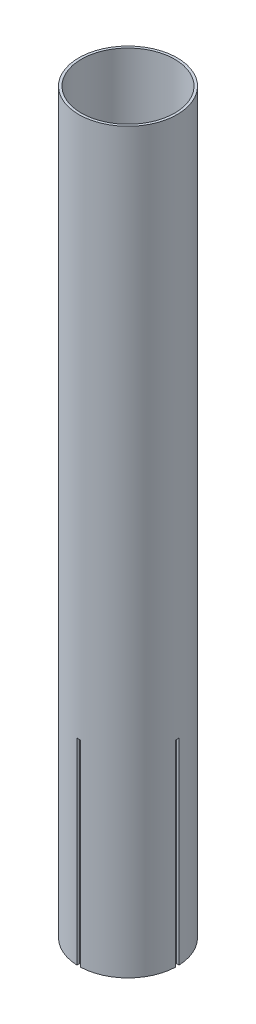
ISO-10303-21;
HEADER;
FILE_DESCRIPTION(('STEP AP214'),'2;1');
FILE_NAME('part.step','',(''),(''),'','','');
FILE_SCHEMA(('AUTOMOTIVE_DESIGN { 1 0 10303 214 1 1 1 1 }'));
ENDSEC;
DATA;
#1=APPLICATION_CONTEXT('core data for automotive mechanical design processes');
#2=APPLICATION_PROTOCOL_DEFINITION('international standard','automotive_design',2000,#1);
#3=PRODUCT_CONTEXT('',#1,'mechanical');
#4=PRODUCT('Part','Part','',(#3));
#5=PRODUCT_RELATED_PRODUCT_CATEGORY('part','',(#4));
#6=PRODUCT_DEFINITION_FORMATION('','',#4);
#7=PRODUCT_DEFINITION_CONTEXT('part definition',#1,'design');
#8=PRODUCT_DEFINITION('design','',#6,#7);
#9=PRODUCT_DEFINITION_SHAPE('','',#8);
#10=(LENGTH_UNIT() NAMED_UNIT(*) SI_UNIT(.MILLI.,.METRE.));
#11=(NAMED_UNIT(*) PLANE_ANGLE_UNIT() SI_UNIT($,.RADIAN.));
#12=(NAMED_UNIT(*) SI_UNIT($,.STERADIAN.) SOLID_ANGLE_UNIT());
#13=UNCERTAINTY_MEASURE_WITH_UNIT(LENGTH_MEASURE(1.E-05),#10,'distance_accuracy_value','');
#14=(GEOMETRIC_REPRESENTATION_CONTEXT(3) GLOBAL_UNCERTAINTY_ASSIGNED_CONTEXT((#13)) GLOBAL_UNIT_ASSIGNED_CONTEXT((#10,
#11,#12)) REPRESENTATION_CONTEXT('',''));
#15=CARTESIAN_POINT('',(0.,0.,0.));
#16=DIRECTION('',(0.,0.,1.));
#17=DIRECTION('',(1.,0.,0.));
#18=AXIS2_PLACEMENT_3D('',#15,#16,#17);
#19=CARTESIAN_POINT('',(0.,0.,0.));
#20=DIRECTION('',(0.,1.,0.));
#21=DIRECTION('',(0.,0.,1.));
#22=AXIS2_PLACEMENT_3D('',#19,#20,#21);
#23=PLANE('',#22);
#24=CARTESIAN_POINT('',(0.,0.,0.));
#25=DIRECTION('',(0.,1.,0.));
#26=DIRECTION('',(0.,0.,1.));
#27=AXIS2_PLACEMENT_3D('',#24,#25,#26);
#28=CIRCLE('',#27,40.);
#29=CARTESIAN_POINT('',(-1.49999999999985,0.,-39.9718651053463));
#30=VERTEX_POINT('',#29);
#31=CARTESIAN_POINT('',(-39.9718651053463,0.,-1.50000000000001));
#32=VERTEX_POINT('',#31);
#33=EDGE_CURVE('E189',#30,#32,#28,.T.);
#34=ORIENTED_EDGE('',*,*,#33,.F.);
#35=DIRECTION('',(0.,0.,1.));
#36=VECTOR('',#35,1.);
#37=CARTESIAN_POINT('',(-1.49999999999985,0.,-40.0000000000001));
#38=LINE('',#37,#36);
#39=CARTESIAN_POINT('',(-1.49999999999986,0.,-37.9703831953274));
#40=VERTEX_POINT('',#39);
#41=EDGE_CURVE('E316',#30,#40,#38,.T.);
#42=ORIENTED_EDGE('',*,*,#41,.T.);
#43=CARTESIAN_POINT('',(0.,0.,0.));
#44=DIRECTION('',(0.,1.,0.));
#45=DIRECTION('',(0.,0.,1.));
#46=AXIS2_PLACEMENT_3D('',#43,#44,#45);
#47=CIRCLE('',#46,38.);
#48=CARTESIAN_POINT('',(-37.9703831953274,0.,-1.50000000000001));
#49=VERTEX_POINT('',#48);
#50=EDGE_CURVE('E257',#40,#49,#47,.T.);
#51=ORIENTED_EDGE('',*,*,#50,.T.);
#52=DIRECTION('',(1.,0.,0.));
#53=VECTOR('',#52,1.);
#54=CARTESIAN_POINT('',(-40.,0.,-1.50000000000001));
#55=LINE('',#54,#53);
#56=EDGE_CURVE('E284',#32,#49,#55,.T.);
#57=ORIENTED_EDGE('',*,*,#56,.F.);
#58=EDGE_LOOP('',(#34,#42,#51,#57));
#59=FACE_BOUND('',#58,.T.);
#60=ADVANCED_FACE('F43',(#59),#23,.F.);
#61=CARTESIAN_POINT('',(37.9703831953274,0.,-1.49999999999999));
#62=VERTEX_POINT('',#61);
#63=CARTESIAN_POINT('',(1.50000000000014,0.,-37.9703831953274));
#64=VERTEX_POINT('',#63);
#65=EDGE_CURVE('E253',#62,#64,#47,.T.);
#66=ORIENTED_EDGE('',*,*,#65,.T.);
#67=DIRECTION('',(0.,0.,1.));
#68=VECTOR('',#67,1.);
#69=CARTESIAN_POINT('',(1.50000000000015,0.,-40.0000000000001));
#70=LINE('',#69,#68);
#71=CARTESIAN_POINT('',(1.50000000000015,0.,-39.9718651053463));
#72=VERTEX_POINT('',#71);
#73=EDGE_CURVE('E67',#72,#64,#70,.T.);
#74=ORIENTED_EDGE('',*,*,#73,.F.);
#75=CARTESIAN_POINT('',(39.9718651053463,0.,-1.49999999999999));
#76=VERTEX_POINT('',#75);
#77=EDGE_CURVE('E183',#76,#72,#28,.T.);
#78=ORIENTED_EDGE('',*,*,#77,.F.);
#79=DIRECTION('',(-1.,0.,0.));
#80=VECTOR('',#79,1.);
#81=CARTESIAN_POINT('',(40.,0.,-1.49999999999999));
#82=LINE('',#81,#80);
#83=EDGE_CURVE('E326',#76,#62,#82,.T.);
#84=ORIENTED_EDGE('',*,*,#83,.T.);
#85=EDGE_LOOP('',(#66,#74,#78,#84));
#86=FACE_BOUND('',#85,.T.);
#87=ADVANCED_FACE('F376',(#86),#23,.F.);
#88=CARTESIAN_POINT('',(-37.9703831953274,0.,1.49999999999999));
#89=VERTEX_POINT('',#88);
#90=CARTESIAN_POINT('',(-1.50000000000012,0.,37.9703831953274));
#91=VERTEX_POINT('',#90);
#92=EDGE_CURVE('E260',#89,#91,#47,.T.);
#93=ORIENTED_EDGE('',*,*,#92,.T.);
#94=CARTESIAN_POINT('',(-1.50000000000013,0.,39.9718651053463));
#95=VERTEX_POINT('',#94);
#96=EDGE_CURVE('E246',#91,#95,#38,.T.);
#97=ORIENTED_EDGE('',*,*,#96,.T.);
#98=CARTESIAN_POINT('',(-39.9718651053463,0.,1.49999999999999));
#99=VERTEX_POINT('',#98);
#100=EDGE_CURVE('E182',#99,#95,#28,.T.);
#101=ORIENTED_EDGE('',*,*,#100,.F.);
#102=DIRECTION('',(1.,0.,0.));
#103=VECTOR('',#102,1.);
#104=CARTESIAN_POINT('',(-40.,0.,1.49999999999999));
#105=LINE('',#104,#103);
#106=EDGE_CURVE('E280',#99,#89,#105,.T.);
#107=ORIENTED_EDGE('',*,*,#106,.T.);
#108=EDGE_LOOP('',(#93,#97,#101,#107));
#109=FACE_BOUND('',#108,.T.);
#110=ADVANCED_FACE('F353',(#109),#23,.F.);
#111=CARTESIAN_POINT('',(0.,600.,0.));
#112=DIRECTION('',(0.,1.,0.));
#113=DIRECTION('',(0.,0.,1.));
#114=AXIS2_PLACEMENT_3D('',#111,#112,#113);
#115=PLANE('',#114);
#116=CARTESIAN_POINT('',(0.,600.,0.));
#117=DIRECTION('',(0.,1.,0.));
#118=DIRECTION('',(0.,0.,1.));
#119=AXIS2_PLACEMENT_3D('',#116,#117,#118);
#120=CIRCLE('',#119,40.);
#121=CARTESIAN_POINT('',(0.,600.,40.));
#122=VERTEX_POINT('',#121);
#123=EDGE_CURVE('E188',#122,#122,#120,.T.);
#124=ORIENTED_EDGE('',*,*,#123,.T.);
#125=EDGE_LOOP('',(#124));
#126=FACE_BOUND('',#125,.T.);
#127=CARTESIAN_POINT('',(0.,600.,0.));
#128=DIRECTION('',(0.,1.,0.));
#129=DIRECTION('',(0.,0.,1.));
#130=AXIS2_PLACEMENT_3D('',#127,#128,#129);
#131=CIRCLE('',#130,38.);
#132=CARTESIAN_POINT('',(0.,600.,38.));
#133=VERTEX_POINT('',#132);
#134=EDGE_CURVE('E265',#133,#133,#131,.T.);
#135=ORIENTED_EDGE('',*,*,#134,.F.);
#136=EDGE_LOOP('',(#135));
#137=FACE_BOUND('',#136,.T.);
#138=ADVANCED_FACE('F382',(#126,#137),#115,.T.);
#139=CARTESIAN_POINT('',(1.49999999999959,0.,37.9703831953274));
#140=VERTEX_POINT('',#139);
#141=CARTESIAN_POINT('',(37.9703831953274,0.,1.50000000000002));
#142=VERTEX_POINT('',#141);
#143=EDGE_CURVE('E256',#140,#142,#47,.T.);
#144=ORIENTED_EDGE('',*,*,#143,.T.);
#145=DIRECTION('',(-1.,0.,0.));
#146=VECTOR('',#145,1.);
#147=CARTESIAN_POINT('',(40.,0.,1.50000000000001));
#148=LINE('',#147,#146);
#149=CARTESIAN_POINT('',(39.9718651053463,0.,1.50000000000001));
#150=VERTEX_POINT('',#149);
#151=EDGE_CURVE('E180',#150,#142,#148,.T.);
#152=ORIENTED_EDGE('',*,*,#151,.F.);
#153=CARTESIAN_POINT('',(1.49999999999957,0.,39.9718651053463));
#154=VERTEX_POINT('',#153);
#155=EDGE_CURVE('E171',#154,#150,#28,.T.);
#156=ORIENTED_EDGE('',*,*,#155,.F.);
#157=DIRECTION('',(0.,0.,-1.));
#158=VECTOR('',#157,1.);
#159=CARTESIAN_POINT('',(1.49999999999957,0.,40.0000000000004));
#160=LINE('',#159,#158);
#161=EDGE_CURVE('E155',#154,#140,#160,.T.);
#162=ORIENTED_EDGE('',*,*,#161,.T.);
#163=EDGE_LOOP('',(#144,#152,#156,#162));
#164=FACE_BOUND('',#163,.T.);
#165=ADVANCED_FACE('F179',(#164),#23,.F.);
#166=CARTESIAN_POINT('',(0.,600.,0.));
#167=DIRECTION('',(0.,-1.,0.));
#168=DIRECTION('',(0.,0.,-1.));
#169=AXIS2_PLACEMENT_3D('',#166,#167,#168);
#170=CYLINDRICAL_SURFACE('',#169,40.);
#171=ORIENTED_EDGE('',*,*,#123,.F.);
#172=EDGE_LOOP('',(#171));
#173=FACE_BOUND('',#172,.T.);
#174=DIRECTION('',(0.,-1.,0.));
#175=VECTOR('',#174,1.);
#176=CARTESIAN_POINT('',(1.50000000000016,600.,-39.9718651053463));
#177=LINE('',#176,#175);
#178=CARTESIAN_POINT('',(1.50000000000015,160.,-39.9718651053463));
#179=VERTEX_POINT('',#178);
#180=EDGE_CURVE('E306',#72,#179,#177,.F.);
#181=ORIENTED_EDGE('',*,*,#180,.T.);
#182=CARTESIAN_POINT('',(0.,160.,0.));
#183=DIRECTION('',(0.,1.,0.));
#184=DIRECTION('',(0.,0.,1.));
#185=AXIS2_PLACEMENT_3D('',#182,#183,#184);
#186=CIRCLE('',#185,40.);
#187=CARTESIAN_POINT('',(-1.49999999999985,160.,-39.9718651053463));
#188=VERTEX_POINT('',#187);
#189=EDGE_CURVE('E305',#179,#188,#186,.T.);
#190=ORIENTED_EDGE('',*,*,#189,.T.);
#191=DIRECTION('',(0.,-1.,0.));
#192=VECTOR('',#191,1.);
#193=CARTESIAN_POINT('',(-1.49999999999984,600.,-39.9718651053463));
#194=LINE('',#193,#192);
#195=EDGE_CURVE('E285',#188,#30,#194,.T.);
#196=ORIENTED_EDGE('',*,*,#195,.T.);
#197=ORIENTED_EDGE('',*,*,#33,.T.);
#198=DIRECTION('',(0.,-1.,0.));
#199=VECTOR('',#198,1.);
#200=CARTESIAN_POINT('',(-39.9718651053463,600.,-1.50000000000002));
#201=LINE('',#200,#199);
#202=CARTESIAN_POINT('',(-39.9718651053463,160.,-1.50000000000001));
#203=VERTEX_POINT('',#202);
#204=EDGE_CURVE('E275',#32,#203,#201,.F.);
#205=ORIENTED_EDGE('',*,*,#204,.T.);
#206=CARTESIAN_POINT('',(0.,160.,0.));
#207=DIRECTION('',(0.,1.,0.));
#208=DIRECTION('',(0.,0.,1.));
#209=AXIS2_PLACEMENT_3D('',#206,#207,#208);
#210=CIRCLE('',#209,40.);
#211=CARTESIAN_POINT('',(-39.9718651053463,160.,1.49999999999999));
#212=VERTEX_POINT('',#211);
#213=EDGE_CURVE('E272',#203,#212,#210,.T.);
#214=ORIENTED_EDGE('',*,*,#213,.T.);
#215=DIRECTION('',(0.,-1.,0.));
#216=VECTOR('',#215,1.);
#217=CARTESIAN_POINT('',(-39.9718651053463,600.,1.49999999999998));
#218=LINE('',#217,#216);
#219=EDGE_CURVE('E261',#212,#99,#218,.T.);
#220=ORIENTED_EDGE('',*,*,#219,.T.);
#221=ORIENTED_EDGE('',*,*,#100,.T.);
#222=DIRECTION('',(0.,-1.,0.));
#223=VECTOR('',#222,1.);
#224=CARTESIAN_POINT('',(-1.50000000000012,600.,39.9718651053463));
#225=LINE('',#224,#223);
#226=CARTESIAN_POINT('',(-1.50000000000013,160.,39.9718651053463));
#227=VERTEX_POINT('',#226);
#228=EDGE_CURVE('E299',#95,#227,#225,.F.);
#229=ORIENTED_EDGE('',*,*,#228,.T.);
#230=CARTESIAN_POINT('',(1.49999999999957,160.,39.9718651053463));
#231=VERTEX_POINT('',#230);
#232=EDGE_CURVE('E173',#227,#231,#186,.T.);
#233=ORIENTED_EDGE('',*,*,#232,.T.);
#234=DIRECTION('',(0.,-1.,0.));
#235=VECTOR('',#234,1.);
#236=CARTESIAN_POINT('',(1.49999999999956,600.,39.9718651053463));
#237=LINE('',#236,#235);
#238=EDGE_CURVE('E158',#231,#154,#237,.T.);
#239=ORIENTED_EDGE('',*,*,#238,.T.);
#240=ORIENTED_EDGE('',*,*,#155,.T.);
#241=DIRECTION('',(0.,-1.,0.));
#242=VECTOR('',#241,1.);
#243=CARTESIAN_POINT('',(39.9718651053463,600.,1.50000000000002));
#244=LINE('',#243,#242);
#245=CARTESIAN_POINT('',(39.9718651053463,160.,1.50000000000001));
#246=VERTEX_POINT('',#245);
#247=EDGE_CURVE('E175',#150,#246,#244,.F.);
#248=ORIENTED_EDGE('',*,*,#247,.T.);
#249=CARTESIAN_POINT('',(39.9718651053463,160.,-1.49999999999999));
#250=VERTEX_POINT('',#249);
#251=EDGE_CURVE('E302',#246,#250,#186,.T.);
#252=ORIENTED_EDGE('',*,*,#251,.T.);
#253=DIRECTION('',(0.,-1.,0.));
#254=VECTOR('',#253,1.);
#255=CARTESIAN_POINT('',(39.9718651053463,600.,-1.49999999999998));
#256=LINE('',#255,#254);
#257=EDGE_CURVE('E244',#250,#76,#256,.T.);
#258=ORIENTED_EDGE('',*,*,#257,.T.);
#259=ORIENTED_EDGE('',*,*,#77,.T.);
#260=EDGE_LOOP('',(#181,#190,#196,#197,#205,#214,#220,#221,#229,#233,#239,#240,#248,#252,#258,#259));
#261=FACE_BOUND('',#260,.T.);
#262=ADVANCED_FACE('F45',(#173,#261),#170,.T.);
#263=CARTESIAN_POINT('',(0.,600.,0.));
#264=DIRECTION('',(0.,-1.,0.));
#265=DIRECTION('',(0.,0.,-1.));
#266=AXIS2_PLACEMENT_3D('',#263,#264,#265);
#267=CYLINDRICAL_SURFACE('',#266,38.);
#268=DIRECTION('',(0.,-1.,0.));
#269=VECTOR('',#268,1.);
#270=CARTESIAN_POINT('',(-1.49999999999985,600.,-37.9703831953274));
#271=LINE('',#270,#269);
#272=CARTESIAN_POINT('',(-1.49999999999986,160.,-37.9703831953274));
#273=VERTEX_POINT('',#272);
#274=EDGE_CURVE('E11',#273,#40,#271,.T.);
#275=ORIENTED_EDGE('',*,*,#274,.F.);
#276=CARTESIAN_POINT('',(0.,160.,0.));
#277=DIRECTION('',(0.,1.,0.));
#278=DIRECTION('',(0.,0.,1.));
#279=AXIS2_PLACEMENT_3D('',#276,#277,#278);
#280=CIRCLE('',#279,38.);
#281=CARTESIAN_POINT('',(1.50000000000014,160.,-37.9703831953274));
#282=VERTEX_POINT('',#281);
#283=EDGE_CURVE('E52',#282,#273,#280,.T.);
#284=ORIENTED_EDGE('',*,*,#283,.F.);
#285=DIRECTION('',(0.,-1.,0.));
#286=VECTOR('',#285,1.);
#287=CARTESIAN_POINT('',(1.50000000000015,600.,-37.9703831953274));
#288=LINE('',#287,#286);
#289=EDGE_CURVE('E217',#64,#282,#288,.F.);
#290=ORIENTED_EDGE('',*,*,#289,.F.);
#291=ORIENTED_EDGE('',*,*,#65,.F.);
#292=DIRECTION('',(0.,-1.,0.));
#293=VECTOR('',#292,1.);
#294=CARTESIAN_POINT('',(37.9703831953274,600.,-1.49999999999998));
#295=LINE('',#294,#293);
#296=CARTESIAN_POINT('',(37.9703831953274,160.,-1.49999999999999));
#297=VERTEX_POINT('',#296);
#298=EDGE_CURVE('E215',#297,#62,#295,.T.);
#299=ORIENTED_EDGE('',*,*,#298,.F.);
#300=CARTESIAN_POINT('',(37.9703831953274,160.,1.50000000000001));
#301=VERTEX_POINT('',#300);
#302=EDGE_CURVE('E209',#301,#297,#280,.T.);
#303=ORIENTED_EDGE('',*,*,#302,.F.);
#304=DIRECTION('',(0.,-1.,0.));
#305=VECTOR('',#304,1.);
#306=CARTESIAN_POINT('',(37.9703831953274,600.,1.50000000000002));
#307=LINE('',#306,#305);
#308=EDGE_CURVE('E212',#142,#301,#307,.F.);
#309=ORIENTED_EDGE('',*,*,#308,.F.);
#310=ORIENTED_EDGE('',*,*,#143,.F.);
#311=DIRECTION('',(0.,-1.,0.));
#312=VECTOR('',#311,1.);
#313=CARTESIAN_POINT('',(1.49999999999959,600.,37.9703831953274));
#314=LINE('',#313,#312);
#315=CARTESIAN_POINT('',(1.49999999999959,160.,37.9703831953274));
#316=VERTEX_POINT('',#315);
#317=EDGE_CURVE('E160',#316,#140,#314,.T.);
#318=ORIENTED_EDGE('',*,*,#317,.F.);
#319=CARTESIAN_POINT('',(-1.50000000000012,160.,37.9703831953274));
#320=VERTEX_POINT('',#319);
#321=EDGE_CURVE('E205',#320,#316,#280,.T.);
#322=ORIENTED_EDGE('',*,*,#321,.F.);
#323=DIRECTION('',(0.,-1.,0.));
#324=VECTOR('',#323,1.);
#325=CARTESIAN_POINT('',(-1.50000000000012,600.,37.9703831953274));
#326=LINE('',#325,#324);
#327=EDGE_CURVE('E208',#91,#320,#326,.F.);
#328=ORIENTED_EDGE('',*,*,#327,.F.);
#329=ORIENTED_EDGE('',*,*,#92,.F.);
#330=DIRECTION('',(0.,-1.,0.));
#331=VECTOR('',#330,1.);
#332=CARTESIAN_POINT('',(-37.9703831953274,600.,1.49999999999998));
#333=LINE('',#332,#331);
#334=CARTESIAN_POINT('',(-37.9703831953274,160.,1.49999999999999));
#335=VERTEX_POINT('',#334);
#336=EDGE_CURVE('E200',#335,#89,#333,.T.);
#337=ORIENTED_EDGE('',*,*,#336,.F.);
#338=CARTESIAN_POINT('',(0.,160.,0.));
#339=DIRECTION('',(0.,1.,0.));
#340=DIRECTION('',(0.,0.,1.));
#341=AXIS2_PLACEMENT_3D('',#338,#339,#340);
#342=CIRCLE('',#341,38.);
#343=CARTESIAN_POINT('',(-37.9703831953274,160.,-1.50000000000001));
#344=VERTEX_POINT('',#343);
#345=EDGE_CURVE('E197',#344,#335,#342,.T.);
#346=ORIENTED_EDGE('',*,*,#345,.F.);
#347=DIRECTION('',(0.,-1.,0.));
#348=VECTOR('',#347,1.);
#349=CARTESIAN_POINT('',(-37.9703831953274,600.,-1.50000000000002));
#350=LINE('',#349,#348);
#351=EDGE_CURVE('E194',#49,#344,#350,.F.);
#352=ORIENTED_EDGE('',*,*,#351,.F.);
#353=ORIENTED_EDGE('',*,*,#50,.F.);
#354=EDGE_LOOP('',(#275,#284,#290,#291,#299,#303,#309,#310,#318,#322,#328,#329,#337,#346,#352,#353));
#355=FACE_BOUND('',#354,.T.);
#356=ORIENTED_EDGE('',*,*,#134,.T.);
#357=EDGE_LOOP('',(#356));
#358=FACE_BOUND('',#357,.T.);
#359=ADVANCED_FACE('F250',(#355,#358),#267,.F.);
#360=CARTESIAN_POINT('',(-40.,160.,1.49999999999999));
#361=DIRECTION('',(0.,0.,1.));
#362=DIRECTION('',(0.,-1.,0.));
#363=AXIS2_PLACEMENT_3D('',#360,#361,#362);
#364=PLANE('',#363);
#365=DIRECTION('',(1.,0.,0.));
#366=VECTOR('',#365,1.);
#367=CARTESIAN_POINT('',(-40.,160.,1.49999999999999));
#368=LINE('',#367,#366);
#369=EDGE_CURVE('E279',#212,#335,#368,.T.);
#370=ORIENTED_EDGE('',*,*,#369,.T.);
#371=ORIENTED_EDGE('',*,*,#336,.T.);
#372=ORIENTED_EDGE('',*,*,#106,.F.);
#373=ORIENTED_EDGE('',*,*,#219,.F.);
#374=EDGE_LOOP('',(#370,#371,#372,#373));
#375=FACE_BOUND('',#374,.T.);
#376=ADVANCED_FACE('F358',(#375),#364,.F.);
#377=CARTESIAN_POINT('',(-40.,160.,-1.50000000000001));
#378=DIRECTION('',(0.,1.,0.));
#379=DIRECTION('',(0.,0.,1.));
#380=AXIS2_PLACEMENT_3D('',#377,#378,#379);
#381=PLANE('',#380);
#382=DIRECTION('',(1.,0.,0.));
#383=VECTOR('',#382,1.);
#384=CARTESIAN_POINT('',(-40.,160.,-1.50000000000001));
#385=LINE('',#384,#383);
#386=EDGE_CURVE('E289',#203,#344,#385,.T.);
#387=ORIENTED_EDGE('',*,*,#386,.T.);
#388=ORIENTED_EDGE('',*,*,#345,.T.);
#389=ORIENTED_EDGE('',*,*,#369,.F.);
#390=ORIENTED_EDGE('',*,*,#213,.F.);
#391=EDGE_LOOP('',(#387,#388,#389,#390));
#392=FACE_BOUND('',#391,.T.);
#393=ADVANCED_FACE('F361',(#392),#381,.F.);
#394=CARTESIAN_POINT('',(-40.,160.,-1.50000000000001));
#395=DIRECTION('',(0.,0.,-1.));
#396=DIRECTION('',(0.,1.,0.));
#397=AXIS2_PLACEMENT_3D('',#394,#395,#396);
#398=PLANE('',#397);
#399=ORIENTED_EDGE('',*,*,#56,.T.);
#400=ORIENTED_EDGE('',*,*,#351,.T.);
#401=ORIENTED_EDGE('',*,*,#386,.F.);
#402=ORIENTED_EDGE('',*,*,#204,.F.);
#403=EDGE_LOOP('',(#399,#400,#401,#402));
#404=FACE_BOUND('',#403,.T.);
#405=ADVANCED_FACE('F365',(#404),#398,.F.);
#406=CARTESIAN_POINT('',(1.49999999999957,160.,40.0000000000004));
#407=DIRECTION('',(1.,0.,0.));
#408=DIRECTION('',(0.,0.,-1.));
#409=AXIS2_PLACEMENT_3D('',#406,#407,#408);
#410=PLANE('',#409);
#411=DIRECTION('',(0.,0.,-1.));
#412=VECTOR('',#411,1.);
#413=CARTESIAN_POINT('',(1.49999999999957,160.,40.0000000000004));
#414=LINE('',#413,#412);
#415=EDGE_CURVE('E59',#231,#316,#414,.T.);
#416=ORIENTED_EDGE('',*,*,#415,.T.);
#417=ORIENTED_EDGE('',*,*,#317,.T.);
#418=ORIENTED_EDGE('',*,*,#161,.F.);
#419=ORIENTED_EDGE('',*,*,#238,.F.);
#420=EDGE_LOOP('',(#416,#417,#418,#419));
#421=FACE_BOUND('',#420,.T.);
#422=ADVANCED_FACE('F157',(#421),#410,.F.);
#423=CARTESIAN_POINT('',(1.50000000000015,160.,-40.0000000000001));
#424=DIRECTION('',(0.,1.,0.));
#425=DIRECTION('',(0.,0.,1.));
#426=AXIS2_PLACEMENT_3D('',#423,#424,#425);
#427=PLANE('',#426);
#428=ORIENTED_EDGE('',*,*,#232,.F.);
#429=DIRECTION('',(0.,0.,1.));
#430=VECTOR('',#429,1.);
#431=CARTESIAN_POINT('',(-1.49999999999985,160.,-40.0000000000001));
#432=LINE('',#431,#430);
#433=EDGE_CURVE('E322',#320,#227,#432,.T.);
#434=ORIENTED_EDGE('',*,*,#433,.F.);
#435=ORIENTED_EDGE('',*,*,#321,.T.);
#436=ORIENTED_EDGE('',*,*,#415,.F.);
#437=EDGE_LOOP('',(#428,#434,#435,#436));
#438=FACE_BOUND('',#437,.T.);
#439=ADVANCED_FACE('F347',(#438),#427,.F.);
#440=CARTESIAN_POINT('',(-1.49999999999985,160.,-40.0000000000001));
#441=DIRECTION('',(-1.,0.,0.));
#442=DIRECTION('',(0.,0.,1.));
#443=AXIS2_PLACEMENT_3D('',#440,#441,#442);
#444=PLANE('',#443);
#445=ORIENTED_EDGE('',*,*,#96,.F.);
#446=ORIENTED_EDGE('',*,*,#327,.T.);
#447=ORIENTED_EDGE('',*,*,#433,.T.);
#448=ORIENTED_EDGE('',*,*,#228,.F.);
#449=EDGE_LOOP('',(#445,#446,#447,#448));
#450=FACE_BOUND('',#449,.T.);
#451=ADVANCED_FACE('F349',(#450),#444,.F.);
#452=CARTESIAN_POINT('',(40.,160.,-1.49999999999999));
#453=DIRECTION('',(0.,0.,-1.));
#454=DIRECTION('',(0.,1.,0.));
#455=AXIS2_PLACEMENT_3D('',#452,#453,#454);
#456=PLANE('',#455);
#457=DIRECTION('',(-1.,0.,0.));
#458=VECTOR('',#457,1.);
#459=CARTESIAN_POINT('',(40.,160.,-1.49999999999999));
#460=LINE('',#459,#458);
#461=EDGE_CURVE('E233',#250,#297,#460,.T.);
#462=ORIENTED_EDGE('',*,*,#461,.T.);
#463=ORIENTED_EDGE('',*,*,#298,.T.);
#464=ORIENTED_EDGE('',*,*,#83,.F.);
#465=ORIENTED_EDGE('',*,*,#257,.F.);
#466=EDGE_LOOP('',(#462,#463,#464,#465));
#467=FACE_BOUND('',#466,.T.);
#468=ADVANCED_FACE('F241',(#467),#456,.F.);
#469=CARTESIAN_POINT('',(40.,160.,1.50000000000001));
#470=DIRECTION('',(0.,0.,1.));
#471=DIRECTION('',(0.,-1.,0.));
#472=AXIS2_PLACEMENT_3D('',#469,#470,#471);
#473=PLANE('',#472);
#474=ORIENTED_EDGE('',*,*,#151,.T.);
#475=ORIENTED_EDGE('',*,*,#308,.T.);
#476=DIRECTION('',(-1.,0.,0.));
#477=VECTOR('',#476,1.);
#478=CARTESIAN_POINT('',(40.,160.,1.50000000000001));
#479=LINE('',#478,#477);
#480=EDGE_CURVE('E235',#246,#301,#479,.T.);
#481=ORIENTED_EDGE('',*,*,#480,.F.);
#482=ORIENTED_EDGE('',*,*,#247,.F.);
#483=EDGE_LOOP('',(#474,#475,#481,#482));
#484=FACE_BOUND('',#483,.T.);
#485=ADVANCED_FACE('F341',(#484),#473,.F.);
#486=ORIENTED_EDGE('',*,*,#480,.T.);
#487=ORIENTED_EDGE('',*,*,#302,.T.);
#488=ORIENTED_EDGE('',*,*,#461,.F.);
#489=ORIENTED_EDGE('',*,*,#251,.F.);
#490=EDGE_LOOP('',(#486,#487,#488,#489));
#491=FACE_BOUND('',#490,.T.);
#492=ADVANCED_FACE('F232',(#491),#427,.F.);
#493=EDGE_CURVE('E176',#188,#273,#432,.T.);
#494=ORIENTED_EDGE('',*,*,#493,.T.);
#495=ORIENTED_EDGE('',*,*,#274,.T.);
#496=ORIENTED_EDGE('',*,*,#41,.F.);
#497=ORIENTED_EDGE('',*,*,#195,.F.);
#498=EDGE_LOOP('',(#494,#495,#496,#497));
#499=FACE_BOUND('',#498,.T.);
#500=ADVANCED_FACE('F373',(#499),#444,.F.);
#501=DIRECTION('',(0.,0.,1.));
#502=VECTOR('',#501,1.);
#503=CARTESIAN_POINT('',(1.50000000000015,160.,-40.0000000000001));
#504=LINE('',#503,#502);
#505=EDGE_CURVE('E319',#179,#282,#504,.T.);
#506=ORIENTED_EDGE('',*,*,#505,.T.);
#507=ORIENTED_EDGE('',*,*,#283,.T.);
#508=ORIENTED_EDGE('',*,*,#493,.F.);
#509=ORIENTED_EDGE('',*,*,#189,.F.);
#510=EDGE_LOOP('',(#506,#507,#508,#509));
#511=FACE_BOUND('',#510,.T.);
#512=ADVANCED_FACE('F374',(#511),#427,.F.);
#513=CARTESIAN_POINT('',(1.50000000000015,160.,-40.0000000000001));
#514=DIRECTION('',(1.,0.,0.));
#515=DIRECTION('',(0.,0.,-1.));
#516=AXIS2_PLACEMENT_3D('',#513,#514,#515);
#517=PLANE('',#516);
#518=ORIENTED_EDGE('',*,*,#73,.T.);
#519=ORIENTED_EDGE('',*,*,#289,.T.);
#520=ORIENTED_EDGE('',*,*,#505,.F.);
#521=ORIENTED_EDGE('',*,*,#180,.F.);
#522=EDGE_LOOP('',(#518,#519,#520,#521));
#523=FACE_BOUND('',#522,.T.);
#524=ADVANCED_FACE('F375',(#523),#517,.F.);
#525=CLOSED_SHELL('',(#60,#87,#110,#138,#165,#262,#359,#376,#393,#405,#422,#439,#451,#468,#485,
#492,#500,#512,#524));
#526=MANIFOLD_SOLID_BREP('B2',#525);
#527=ADVANCED_BREP_SHAPE_REPRESENTATION('',(#18,#526),#14);
#528=SHAPE_DEFINITION_REPRESENTATION(#9,#527);
ENDSEC;
END-ISO-10303-21;
